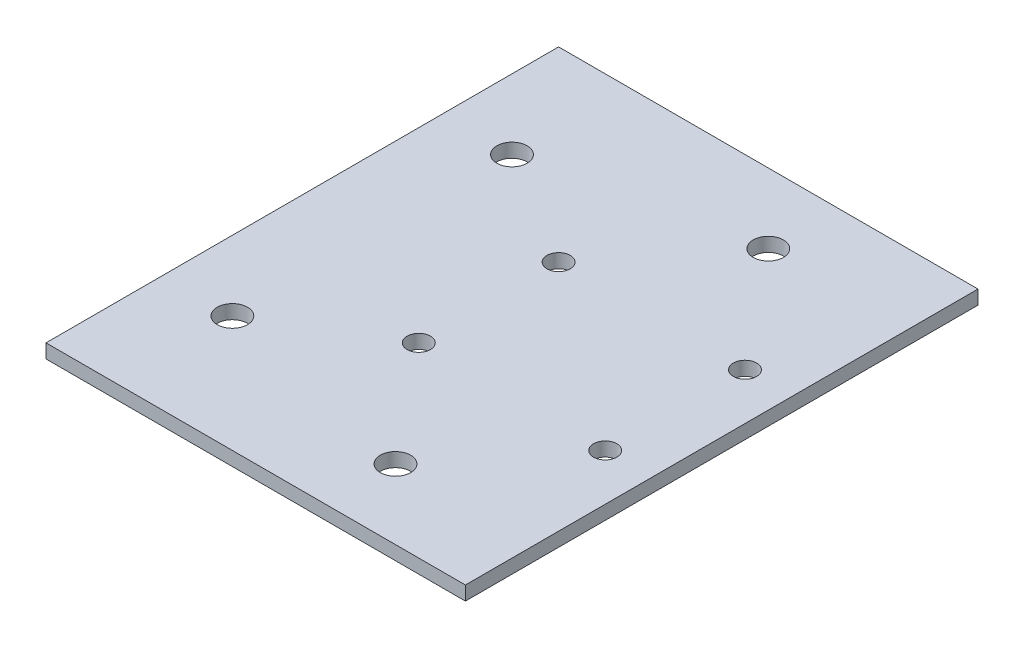
ISO-10303-21;
HEADER;
FILE_DESCRIPTION(('STEP AP214'),'2;1');
FILE_NAME('part.step','',(''),(''),'','','');
FILE_SCHEMA(('AUTOMOTIVE_DESIGN { 1 0 10303 214 1 1 1 1 }'));
ENDSEC;
DATA;
#1=APPLICATION_CONTEXT('core data for automotive mechanical design processes');
#2=APPLICATION_PROTOCOL_DEFINITION('international standard','automotive_design',2000,#1);
#3=PRODUCT_CONTEXT('',#1,'mechanical');
#4=PRODUCT('Part','Part','',(#3));
#5=PRODUCT_RELATED_PRODUCT_CATEGORY('part','',(#4));
#6=PRODUCT_DEFINITION_FORMATION('','',#4);
#7=PRODUCT_DEFINITION_CONTEXT('part definition',#1,'design');
#8=PRODUCT_DEFINITION('design','',#6,#7);
#9=PRODUCT_DEFINITION_SHAPE('','',#8);
#10=(LENGTH_UNIT() NAMED_UNIT(*) SI_UNIT(.MILLI.,.METRE.));
#11=(NAMED_UNIT(*) PLANE_ANGLE_UNIT() SI_UNIT($,.RADIAN.));
#12=(NAMED_UNIT(*) SI_UNIT($,.STERADIAN.) SOLID_ANGLE_UNIT());
#13=UNCERTAINTY_MEASURE_WITH_UNIT(LENGTH_MEASURE(1.E-05),#10,'distance_accuracy_value','');
#14=(GEOMETRIC_REPRESENTATION_CONTEXT(3) GLOBAL_UNCERTAINTY_ASSIGNED_CONTEXT((#13)) GLOBAL_UNIT_ASSIGNED_CONTEXT((#10,
#11,#12)) REPRESENTATION_CONTEXT('',''));
#15=CARTESIAN_POINT('',(0.,0.,0.));
#16=DIRECTION('',(0.,0.,1.));
#17=DIRECTION('',(1.,0.,0.));
#18=AXIS2_PLACEMENT_3D('',#15,#16,#17);
#19=CARTESIAN_POINT('',(0.,3.,0.));
#20=DIRECTION('',(0.,1.,0.));
#21=DIRECTION('',(0.,0.,1.));
#22=AXIS2_PLACEMENT_3D('',#19,#20,#21);
#23=PLANE('',#22);
#24=CARTESIAN_POINT('',(15.,3.,40.));
#25=DIRECTION('',(0.,1.,0.));
#26=DIRECTION('',(0.,0.,1.));
#27=AXIS2_PLACEMENT_3D('',#24,#25,#26);
#28=CIRCLE('',#27,3.25);
#29=CARTESIAN_POINT('',(15.,3.,43.25));
#30=VERTEX_POINT('',#29);
#31=EDGE_CURVE('E174',#30,#30,#28,.T.);
#32=ORIENTED_EDGE('',*,*,#31,.F.);
#33=EDGE_LOOP('',(#32));
#34=FACE_BOUND('',#33,.T.);
#35=CARTESIAN_POINT('',(35.,3.,15.));
#36=DIRECTION('',(0.,1.,0.));
#37=DIRECTION('',(0.,0.,1.));
#38=AXIS2_PLACEMENT_3D('',#35,#36,#37);
#39=CIRCLE('',#38,2.5);
#40=CARTESIAN_POINT('',(35.,3.,17.5));
#41=VERTEX_POINT('',#40);
#42=EDGE_CURVE('E158',#41,#41,#39,.T.);
#43=ORIENTED_EDGE('',*,*,#42,.F.);
#44=EDGE_LOOP('',(#43));
#45=FACE_BOUND('',#44,.T.);
#46=CARTESIAN_POINT('',(-5.,3.,-15.));
#47=DIRECTION('',(0.,1.,0.));
#48=DIRECTION('',(0.,0.,1.));
#49=AXIS2_PLACEMENT_3D('',#46,#47,#48);
#50=CIRCLE('',#49,2.5);
#51=CARTESIAN_POINT('',(-5.,3.,-12.5));
#52=VERTEX_POINT('',#51);
#53=EDGE_CURVE('E142',#52,#52,#50,.T.);
#54=ORIENTED_EDGE('',*,*,#53,.F.);
#55=EDGE_LOOP('',(#54));
#56=FACE_BOUND('',#55,.T.);
#57=CARTESIAN_POINT('',(-30.,3.,-30.));
#58=DIRECTION('',(0.,1.,0.));
#59=DIRECTION('',(0.,0.,1.));
#60=AXIS2_PLACEMENT_3D('',#57,#58,#59);
#61=CIRCLE('',#60,3.25000000000001);
#62=CARTESIAN_POINT('',(-30.,3.,-26.75));
#63=VERTEX_POINT('',#62);
#64=EDGE_CURVE('E112',#63,#63,#61,.T.);
#65=ORIENTED_EDGE('',*,*,#64,.F.);
#66=EDGE_LOOP('',(#65));
#67=FACE_BOUND('',#66,.T.);
#68=DIRECTION('',(0.,0.,-1.));
#69=VECTOR('',#68,1.);
#70=CARTESIAN_POINT('',(45.,3.,-55.));
#71=LINE('',#70,#69);
#72=CARTESIAN_POINT('',(45.,3.,55.));
#73=VERTEX_POINT('',#72);
#74=CARTESIAN_POINT('',(45.,3.,-55.));
#75=VERTEX_POINT('',#74);
#76=EDGE_CURVE('E92',#73,#75,#71,.T.);
#77=ORIENTED_EDGE('',*,*,#76,.T.);
#78=DIRECTION('',(-1.,0.,0.));
#79=VECTOR('',#78,1.);
#80=CARTESIAN_POINT('',(-45.,3.,-55.));
#81=LINE('',#80,#79);
#82=CARTESIAN_POINT('',(-45.,3.,-55.));
#83=VERTEX_POINT('',#82);
#84=EDGE_CURVE('E87',#75,#83,#81,.T.);
#85=ORIENTED_EDGE('',*,*,#84,.T.);
#86=DIRECTION('',(0.,0.,1.));
#87=VECTOR('',#86,1.);
#88=CARTESIAN_POINT('',(-45.,3.,-55.));
#89=LINE('',#88,#87);
#90=CARTESIAN_POINT('',(-45.,3.,55.));
#91=VERTEX_POINT('',#90);
#92=EDGE_CURVE('E90',#83,#91,#89,.T.);
#93=ORIENTED_EDGE('',*,*,#92,.T.);
#94=DIRECTION('',(1.,0.,0.));
#95=VECTOR('',#94,1.);
#96=CARTESIAN_POINT('',(-45.,3.,55.));
#97=LINE('',#96,#95);
#98=EDGE_CURVE('E57',#91,#73,#97,.T.);
#99=ORIENTED_EDGE('',*,*,#98,.T.);
#100=EDGE_LOOP('',(#77,#85,#93,#99));
#101=FACE_BOUND('',#100,.T.);
#102=CARTESIAN_POINT('',(-30.,3.,30.));
#103=DIRECTION('',(0.,1.,0.));
#104=DIRECTION('',(0.,0.,1.));
#105=AXIS2_PLACEMENT_3D('',#102,#103,#104);
#106=CIRCLE('',#105,3.24999999999999);
#107=CARTESIAN_POINT('',(-30.,3.,33.25));
#108=VERTEX_POINT('',#107);
#109=EDGE_CURVE('E134',#108,#108,#106,.T.);
#110=ORIENTED_EDGE('',*,*,#109,.F.);
#111=EDGE_LOOP('',(#110));
#112=FACE_BOUND('',#111,.T.);
#113=CARTESIAN_POINT('',(35.,3.,-15.));
#114=DIRECTION('',(0.,1.,0.));
#115=DIRECTION('',(0.,0.,1.));
#116=AXIS2_PLACEMENT_3D('',#113,#114,#115);
#117=CIRCLE('',#116,2.5);
#118=CARTESIAN_POINT('',(35.,3.,-12.5));
#119=VERTEX_POINT('',#118);
#120=EDGE_CURVE('E150',#119,#119,#117,.T.);
#121=ORIENTED_EDGE('',*,*,#120,.F.);
#122=EDGE_LOOP('',(#121));
#123=FACE_BOUND('',#122,.T.);
#124=CARTESIAN_POINT('',(-5.,3.,15.));
#125=DIRECTION('',(0.,1.,0.));
#126=DIRECTION('',(0.,0.,1.));
#127=AXIS2_PLACEMENT_3D('',#124,#125,#126);
#128=CIRCLE('',#127,2.5);
#129=CARTESIAN_POINT('',(-5.,3.,17.5));
#130=VERTEX_POINT('',#129);
#131=EDGE_CURVE('E166',#130,#130,#128,.T.);
#132=ORIENTED_EDGE('',*,*,#131,.F.);
#133=EDGE_LOOP('',(#132));
#134=FACE_BOUND('',#133,.T.);
#135=CARTESIAN_POINT('',(15.,3.,-40.));
#136=DIRECTION('',(0.,1.,0.));
#137=DIRECTION('',(0.,0.,1.));
#138=AXIS2_PLACEMENT_3D('',#135,#136,#137);
#139=CIRCLE('',#138,3.25);
#140=CARTESIAN_POINT('',(15.,3.,-36.75));
#141=VERTEX_POINT('',#140);
#142=EDGE_CURVE('E182',#141,#141,#139,.T.);
#143=ORIENTED_EDGE('',*,*,#142,.F.);
#144=EDGE_LOOP('',(#143));
#145=FACE_BOUND('',#144,.T.);
#146=ADVANCED_FACE('F39',(#34,#45,#56,#67,#101,#112,#123,#134,#145),#23,.T.);
#147=CARTESIAN_POINT('',(0.,0.,0.));
#148=DIRECTION('',(0.,1.,0.));
#149=DIRECTION('',(0.,0.,1.));
#150=AXIS2_PLACEMENT_3D('',#147,#148,#149);
#151=PLANE('',#150);
#152=DIRECTION('',(0.,0.,-1.));
#153=VECTOR('',#152,1.);
#154=CARTESIAN_POINT('',(45.,0.,-55.));
#155=LINE('',#154,#153);
#156=CARTESIAN_POINT('',(45.,0.,55.));
#157=VERTEX_POINT('',#156);
#158=CARTESIAN_POINT('',(45.,0.,-55.));
#159=VERTEX_POINT('',#158);
#160=EDGE_CURVE('E108',#157,#159,#155,.T.);
#161=ORIENTED_EDGE('',*,*,#160,.F.);
#162=DIRECTION('',(1.,0.,0.));
#163=VECTOR('',#162,1.);
#164=CARTESIAN_POINT('',(-45.,0.,55.));
#165=LINE('',#164,#163);
#166=CARTESIAN_POINT('',(-45.,0.,55.));
#167=VERTEX_POINT('',#166);
#168=EDGE_CURVE('E80',#167,#157,#165,.T.);
#169=ORIENTED_EDGE('',*,*,#168,.F.);
#170=DIRECTION('',(0.,0.,1.));
#171=VECTOR('',#170,1.);
#172=CARTESIAN_POINT('',(-45.,0.,-55.));
#173=LINE('',#172,#171);
#174=CARTESIAN_POINT('',(-45.,0.,-55.));
#175=VERTEX_POINT('',#174);
#176=EDGE_CURVE('E74',#175,#167,#173,.T.);
#177=ORIENTED_EDGE('',*,*,#176,.F.);
#178=DIRECTION('',(-1.,0.,0.));
#179=VECTOR('',#178,1.);
#180=CARTESIAN_POINT('',(-45.,0.,-55.));
#181=LINE('',#180,#179);
#182=EDGE_CURVE('E97',#159,#175,#181,.T.);
#183=ORIENTED_EDGE('',*,*,#182,.F.);
#184=EDGE_LOOP('',(#161,#169,#177,#183));
#185=FACE_BOUND('',#184,.T.);
#186=CARTESIAN_POINT('',(-30.,0.,-30.));
#187=DIRECTION('',(0.,1.,0.));
#188=DIRECTION('',(0.,0.,1.));
#189=AXIS2_PLACEMENT_3D('',#186,#187,#188);
#190=CIRCLE('',#189,3.25000000000001);
#191=CARTESIAN_POINT('',(-30.,0.,-26.75));
#192=VERTEX_POINT('',#191);
#193=EDGE_CURVE('E130',#192,#192,#190,.T.);
#194=ORIENTED_EDGE('',*,*,#193,.T.);
#195=EDGE_LOOP('',(#194));
#196=FACE_BOUND('',#195,.T.);
#197=CARTESIAN_POINT('',(-30.,0.,30.));
#198=DIRECTION('',(0.,1.,0.));
#199=DIRECTION('',(0.,0.,1.));
#200=AXIS2_PLACEMENT_3D('',#197,#198,#199);
#201=CIRCLE('',#200,3.24999999999999);
#202=CARTESIAN_POINT('',(-30.,0.,33.25));
#203=VERTEX_POINT('',#202);
#204=EDGE_CURVE('E138',#203,#203,#201,.T.);
#205=ORIENTED_EDGE('',*,*,#204,.T.);
#206=EDGE_LOOP('',(#205));
#207=FACE_BOUND('',#206,.T.);
#208=CARTESIAN_POINT('',(-5.,0.,-15.));
#209=DIRECTION('',(0.,1.,0.));
#210=DIRECTION('',(0.,0.,1.));
#211=AXIS2_PLACEMENT_3D('',#208,#209,#210);
#212=CIRCLE('',#211,2.5);
#213=CARTESIAN_POINT('',(-5.,0.,-12.5));
#214=VERTEX_POINT('',#213);
#215=EDGE_CURVE('E146',#214,#214,#212,.T.);
#216=ORIENTED_EDGE('',*,*,#215,.T.);
#217=EDGE_LOOP('',(#216));
#218=FACE_BOUND('',#217,.T.);
#219=CARTESIAN_POINT('',(35.,0.,-15.));
#220=DIRECTION('',(0.,1.,0.));
#221=DIRECTION('',(0.,0.,1.));
#222=AXIS2_PLACEMENT_3D('',#219,#220,#221);
#223=CIRCLE('',#222,2.5);
#224=CARTESIAN_POINT('',(35.,0.,-12.5));
#225=VERTEX_POINT('',#224);
#226=EDGE_CURVE('E154',#225,#225,#223,.T.);
#227=ORIENTED_EDGE('',*,*,#226,.T.);
#228=EDGE_LOOP('',(#227));
#229=FACE_BOUND('',#228,.T.);
#230=CARTESIAN_POINT('',(35.,0.,15.));
#231=DIRECTION('',(0.,1.,0.));
#232=DIRECTION('',(0.,0.,1.));
#233=AXIS2_PLACEMENT_3D('',#230,#231,#232);
#234=CIRCLE('',#233,2.5);
#235=CARTESIAN_POINT('',(35.,0.,17.5));
#236=VERTEX_POINT('',#235);
#237=EDGE_CURVE('E162',#236,#236,#234,.T.);
#238=ORIENTED_EDGE('',*,*,#237,.T.);
#239=EDGE_LOOP('',(#238));
#240=FACE_BOUND('',#239,.T.);
#241=CARTESIAN_POINT('',(-5.,0.,15.));
#242=DIRECTION('',(0.,1.,0.));
#243=DIRECTION('',(0.,0.,1.));
#244=AXIS2_PLACEMENT_3D('',#241,#242,#243);
#245=CIRCLE('',#244,2.5);
#246=CARTESIAN_POINT('',(-5.,0.,17.5));
#247=VERTEX_POINT('',#246);
#248=EDGE_CURVE('E170',#247,#247,#245,.T.);
#249=ORIENTED_EDGE('',*,*,#248,.T.);
#250=EDGE_LOOP('',(#249));
#251=FACE_BOUND('',#250,.T.);
#252=CARTESIAN_POINT('',(15.,0.,40.));
#253=DIRECTION('',(0.,1.,0.));
#254=DIRECTION('',(0.,0.,1.));
#255=AXIS2_PLACEMENT_3D('',#252,#253,#254);
#256=CIRCLE('',#255,3.25);
#257=CARTESIAN_POINT('',(15.,0.,43.25));
#258=VERTEX_POINT('',#257);
#259=EDGE_CURVE('E178',#258,#258,#256,.T.);
#260=ORIENTED_EDGE('',*,*,#259,.T.);
#261=EDGE_LOOP('',(#260));
#262=FACE_BOUND('',#261,.T.);
#263=CARTESIAN_POINT('',(15.,0.,-40.));
#264=DIRECTION('',(0.,1.,0.));
#265=DIRECTION('',(0.,0.,1.));
#266=AXIS2_PLACEMENT_3D('',#263,#264,#265);
#267=CIRCLE('',#266,3.25);
#268=CARTESIAN_POINT('',(15.,0.,-36.75));
#269=VERTEX_POINT('',#268);
#270=EDGE_CURVE('E186',#269,#269,#267,.T.);
#271=ORIENTED_EDGE('',*,*,#270,.T.);
#272=EDGE_LOOP('',(#271));
#273=FACE_BOUND('',#272,.T.);
#274=ADVANCED_FACE('F125',(#185,#196,#207,#218,#229,#240,#251,#262,#273),#151,.F.);
#275=CARTESIAN_POINT('',(45.,3.,-55.));
#276=DIRECTION('',(-1.,0.,0.));
#277=DIRECTION('',(0.,0.,1.));
#278=AXIS2_PLACEMENT_3D('',#275,#276,#277);
#279=PLANE('',#278);
#280=ORIENTED_EDGE('',*,*,#160,.T.);
#281=DIRECTION('',(0.,-1.,0.));
#282=VECTOR('',#281,1.);
#283=CARTESIAN_POINT('',(45.,3.,-55.));
#284=LINE('',#283,#282);
#285=EDGE_CURVE('E11',#75,#159,#284,.T.);
#286=ORIENTED_EDGE('',*,*,#285,.F.);
#287=ORIENTED_EDGE('',*,*,#76,.F.);
#288=DIRECTION('',(0.,-1.,0.));
#289=VECTOR('',#288,1.);
#290=CARTESIAN_POINT('',(45.,3.,55.));
#291=LINE('',#290,#289);
#292=EDGE_CURVE('E104',#73,#157,#291,.T.);
#293=ORIENTED_EDGE('',*,*,#292,.T.);
#294=EDGE_LOOP('',(#280,#286,#287,#293));
#295=FACE_BOUND('',#294,.T.);
#296=ADVANCED_FACE('F41',(#295),#279,.F.);
#297=CARTESIAN_POINT('',(-45.,3.,-55.));
#298=DIRECTION('',(0.,0.,1.));
#299=DIRECTION('',(1.,0.,0.));
#300=AXIS2_PLACEMENT_3D('',#297,#298,#299);
#301=PLANE('',#300);
#302=ORIENTED_EDGE('',*,*,#182,.T.);
#303=DIRECTION('',(0.,-1.,0.));
#304=VECTOR('',#303,1.);
#305=CARTESIAN_POINT('',(-45.,3.,-55.));
#306=LINE('',#305,#304);
#307=EDGE_CURVE('E49',#83,#175,#306,.T.);
#308=ORIENTED_EDGE('',*,*,#307,.F.);
#309=ORIENTED_EDGE('',*,*,#84,.F.);
#310=ORIENTED_EDGE('',*,*,#285,.T.);
#311=EDGE_LOOP('',(#302,#308,#309,#310));
#312=FACE_BOUND('',#311,.T.);
#313=ADVANCED_FACE('F96',(#312),#301,.F.);
#314=CARTESIAN_POINT('',(-45.,3.,-55.));
#315=DIRECTION('',(1.,0.,0.));
#316=DIRECTION('',(0.,0.,-1.));
#317=AXIS2_PLACEMENT_3D('',#314,#315,#316);
#318=PLANE('',#317);
#319=ORIENTED_EDGE('',*,*,#176,.T.);
#320=DIRECTION('',(0.,-1.,0.));
#321=VECTOR('',#320,1.);
#322=CARTESIAN_POINT('',(-45.,3.,55.));
#323=LINE('',#322,#321);
#324=EDGE_CURVE('E99',#91,#167,#323,.T.);
#325=ORIENTED_EDGE('',*,*,#324,.F.);
#326=ORIENTED_EDGE('',*,*,#92,.F.);
#327=ORIENTED_EDGE('',*,*,#307,.T.);
#328=EDGE_LOOP('',(#319,#325,#326,#327));
#329=FACE_BOUND('',#328,.T.);
#330=ADVANCED_FACE('F100',(#329),#318,.F.);
#331=CARTESIAN_POINT('',(-45.,3.,55.));
#332=DIRECTION('',(0.,0.,-1.));
#333=DIRECTION('',(-1.,0.,0.));
#334=AXIS2_PLACEMENT_3D('',#331,#332,#333);
#335=PLANE('',#334);
#336=ORIENTED_EDGE('',*,*,#168,.T.);
#337=ORIENTED_EDGE('',*,*,#292,.F.);
#338=ORIENTED_EDGE('',*,*,#98,.F.);
#339=ORIENTED_EDGE('',*,*,#324,.T.);
#340=EDGE_LOOP('',(#336,#337,#338,#339));
#341=FACE_BOUND('',#340,.T.);
#342=ADVANCED_FACE('F122',(#341),#335,.F.);
#343=CARTESIAN_POINT('',(-30.,3.,-30.));
#344=DIRECTION('',(0.,-1.,0.));
#345=DIRECTION('',(0.,0.,-1.));
#346=AXIS2_PLACEMENT_3D('',#343,#344,#345);
#347=CYLINDRICAL_SURFACE('',#346,3.25000000000001);
#348=ORIENTED_EDGE('',*,*,#64,.T.);
#349=EDGE_LOOP('',(#348));
#350=FACE_BOUND('',#349,.T.);
#351=ORIENTED_EDGE('',*,*,#193,.F.);
#352=EDGE_LOOP('',(#351));
#353=FACE_BOUND('',#352,.T.);
#354=ADVANCED_FACE('F207',(#350,#353),#347,.F.);
#355=CARTESIAN_POINT('',(-30.,3.,30.));
#356=DIRECTION('',(0.,-1.,0.));
#357=DIRECTION('',(0.,0.,-1.));
#358=AXIS2_PLACEMENT_3D('',#355,#356,#357);
#359=CYLINDRICAL_SURFACE('',#358,3.24999999999999);
#360=ORIENTED_EDGE('',*,*,#109,.T.);
#361=EDGE_LOOP('',(#360));
#362=FACE_BOUND('',#361,.T.);
#363=ORIENTED_EDGE('',*,*,#204,.F.);
#364=EDGE_LOOP('',(#363));
#365=FACE_BOUND('',#364,.T.);
#366=ADVANCED_FACE('F253',(#362,#365),#359,.F.);
#367=CARTESIAN_POINT('',(-5.,3.,-15.));
#368=DIRECTION('',(0.,-1.,0.));
#369=DIRECTION('',(0.,0.,-1.));
#370=AXIS2_PLACEMENT_3D('',#367,#368,#369);
#371=CYLINDRICAL_SURFACE('',#370,2.5);
#372=ORIENTED_EDGE('',*,*,#53,.T.);
#373=EDGE_LOOP('',(#372));
#374=FACE_BOUND('',#373,.T.);
#375=ORIENTED_EDGE('',*,*,#215,.F.);
#376=EDGE_LOOP('',(#375));
#377=FACE_BOUND('',#376,.T.);
#378=ADVANCED_FACE('F261',(#374,#377),#371,.F.);
#379=CARTESIAN_POINT('',(35.,3.,-15.));
#380=DIRECTION('',(0.,-1.,0.));
#381=DIRECTION('',(0.,0.,-1.));
#382=AXIS2_PLACEMENT_3D('',#379,#380,#381);
#383=CYLINDRICAL_SURFACE('',#382,2.5);
#384=ORIENTED_EDGE('',*,*,#120,.T.);
#385=EDGE_LOOP('',(#384));
#386=FACE_BOUND('',#385,.T.);
#387=ORIENTED_EDGE('',*,*,#226,.F.);
#388=EDGE_LOOP('',(#387));
#389=FACE_BOUND('',#388,.T.);
#390=ADVANCED_FACE('F269',(#386,#389),#383,.F.);
#391=CARTESIAN_POINT('',(35.,3.,15.));
#392=DIRECTION('',(0.,-1.,0.));
#393=DIRECTION('',(0.,0.,-1.));
#394=AXIS2_PLACEMENT_3D('',#391,#392,#393);
#395=CYLINDRICAL_SURFACE('',#394,2.5);
#396=ORIENTED_EDGE('',*,*,#42,.T.);
#397=EDGE_LOOP('',(#396));
#398=FACE_BOUND('',#397,.T.);
#399=ORIENTED_EDGE('',*,*,#237,.F.);
#400=EDGE_LOOP('',(#399));
#401=FACE_BOUND('',#400,.T.);
#402=ADVANCED_FACE('F278',(#398,#401),#395,.F.);
#403=CARTESIAN_POINT('',(-5.,3.,15.));
#404=DIRECTION('',(0.,-1.,0.));
#405=DIRECTION('',(0.,0.,-1.));
#406=AXIS2_PLACEMENT_3D('',#403,#404,#405);
#407=CYLINDRICAL_SURFACE('',#406,2.5);
#408=ORIENTED_EDGE('',*,*,#131,.T.);
#409=EDGE_LOOP('',(#408));
#410=FACE_BOUND('',#409,.T.);
#411=ORIENTED_EDGE('',*,*,#248,.F.);
#412=EDGE_LOOP('',(#411));
#413=FACE_BOUND('',#412,.T.);
#414=ADVANCED_FACE('F287',(#410,#413),#407,.F.);
#415=CARTESIAN_POINT('',(15.,3.,40.));
#416=DIRECTION('',(0.,-1.,0.));
#417=DIRECTION('',(0.,0.,-1.));
#418=AXIS2_PLACEMENT_3D('',#415,#416,#417);
#419=CYLINDRICAL_SURFACE('',#418,3.25);
#420=ORIENTED_EDGE('',*,*,#31,.T.);
#421=EDGE_LOOP('',(#420));
#422=FACE_BOUND('',#421,.T.);
#423=ORIENTED_EDGE('',*,*,#259,.F.);
#424=EDGE_LOOP('',(#423));
#425=FACE_BOUND('',#424,.T.);
#426=ADVANCED_FACE('F296',(#422,#425),#419,.F.);
#427=CARTESIAN_POINT('',(15.,3.,-40.));
#428=DIRECTION('',(0.,-1.,0.));
#429=DIRECTION('',(0.,0.,-1.));
#430=AXIS2_PLACEMENT_3D('',#427,#428,#429);
#431=CYLINDRICAL_SURFACE('',#430,3.25);
#432=ORIENTED_EDGE('',*,*,#142,.T.);
#433=EDGE_LOOP('',(#432));
#434=FACE_BOUND('',#433,.T.);
#435=ORIENTED_EDGE('',*,*,#270,.F.);
#436=EDGE_LOOP('',(#435));
#437=FACE_BOUND('',#436,.T.);
#438=ADVANCED_FACE('F194',(#434,#437),#431,.F.);
#439=CLOSED_SHELL('',(#146,#274,#296,#313,#330,#342,#354,#366,#378,#390,#402,#414,#426,#438));
#440=MANIFOLD_SOLID_BREP('B2',#439);
#441=ADVANCED_BREP_SHAPE_REPRESENTATION('',(#18,#440),#14);
#442=SHAPE_DEFINITION_REPRESENTATION(#9,#441);
ENDSEC;
END-ISO-10303-21;
